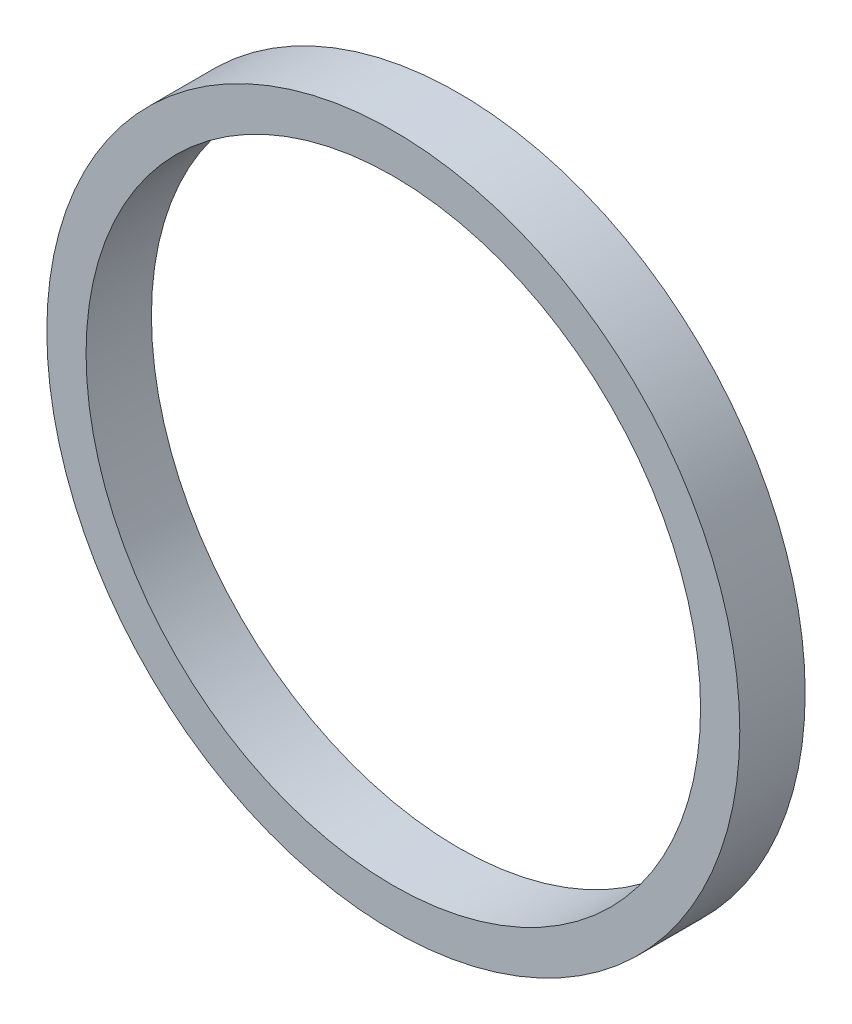
ISO-10303-21;
HEADER;
FILE_DESCRIPTION(('STEP AP214'),'2;1');
FILE_NAME('part.step','',(''),(''),'','','');
FILE_SCHEMA(('AUTOMOTIVE_DESIGN { 1 0 10303 214 1 1 1 1 }'));
ENDSEC;
DATA;
#1=APPLICATION_CONTEXT('core data for automotive mechanical design processes');
#2=APPLICATION_PROTOCOL_DEFINITION('international standard','automotive_design',2000,#1);
#3=PRODUCT_CONTEXT('',#1,'mechanical');
#4=PRODUCT('Part','Part','',(#3));
#5=PRODUCT_RELATED_PRODUCT_CATEGORY('part','',(#4));
#6=PRODUCT_DEFINITION_FORMATION('','',#4);
#7=PRODUCT_DEFINITION_CONTEXT('part definition',#1,'design');
#8=PRODUCT_DEFINITION('design','',#6,#7);
#9=PRODUCT_DEFINITION_SHAPE('','',#8);
#10=(LENGTH_UNIT() NAMED_UNIT(*) SI_UNIT(.MILLI.,.METRE.));
#11=(NAMED_UNIT(*) PLANE_ANGLE_UNIT() SI_UNIT($,.RADIAN.));
#12=(NAMED_UNIT(*) SI_UNIT($,.STERADIAN.) SOLID_ANGLE_UNIT());
#13=UNCERTAINTY_MEASURE_WITH_UNIT(LENGTH_MEASURE(1.E-05),#10,'distance_accuracy_value','');
#14=(GEOMETRIC_REPRESENTATION_CONTEXT(3) GLOBAL_UNCERTAINTY_ASSIGNED_CONTEXT((#13)) GLOBAL_UNIT_ASSIGNED_CONTEXT((#10,
#11,#12)) REPRESENTATION_CONTEXT('',''));
#15=CARTESIAN_POINT('',(0.,0.,0.));
#16=DIRECTION('',(0.,0.,1.));
#17=DIRECTION('',(1.,0.,0.));
#18=AXIS2_PLACEMENT_3D('',#15,#16,#17);
#19=CARTESIAN_POINT('',(0.,0.,3.));
#20=DIRECTION('',(0.,0.,1.));
#21=DIRECTION('',(1.,0.,0.));
#22=AXIS2_PLACEMENT_3D('',#19,#20,#21);
#23=PLANE('',#22);
#24=CARTESIAN_POINT('',(0.,0.,3.));
#25=DIRECTION('',(0.,0.,1.));
#26=DIRECTION('',(1.,0.,0.));
#27=AXIS2_PLACEMENT_3D('',#24,#25,#26);
#28=CIRCLE('',#27,15.9);
#29=CARTESIAN_POINT('',(15.9,0.,3.));
#30=VERTEX_POINT('',#29);
#31=EDGE_CURVE('E11',#30,#30,#28,.T.);
#32=ORIENTED_EDGE('',*,*,#31,.T.);
#33=EDGE_LOOP('',(#32));
#34=FACE_BOUND('',#33,.T.);
#35=CARTESIAN_POINT('',(0.,0.,3.));
#36=DIRECTION('',(0.,0.,1.));
#37=DIRECTION('',(1.,0.,0.));
#38=AXIS2_PLACEMENT_3D('',#35,#36,#37);
#39=CIRCLE('',#38,14.1);
#40=CARTESIAN_POINT('',(14.1,0.,3.));
#41=VERTEX_POINT('',#40);
#42=EDGE_CURVE('E58',#41,#41,#39,.T.);
#43=ORIENTED_EDGE('',*,*,#42,.F.);
#44=EDGE_LOOP('',(#43));
#45=FACE_BOUND('',#44,.T.);
#46=ADVANCED_FACE('F44',(#34,#45),#23,.T.);
#47=CARTESIAN_POINT('',(0.,0.,0.));
#48=DIRECTION('',(0.,0.,1.));
#49=DIRECTION('',(1.,0.,0.));
#50=AXIS2_PLACEMENT_3D('',#47,#48,#49);
#51=PLANE('',#50);
#52=CARTESIAN_POINT('',(0.,0.,0.));
#53=DIRECTION('',(0.,0.,1.));
#54=DIRECTION('',(1.,0.,0.));
#55=AXIS2_PLACEMENT_3D('',#52,#53,#54);
#56=CIRCLE('',#55,15.9);
#57=CARTESIAN_POINT('',(15.9,0.,0.));
#58=VERTEX_POINT('',#57);
#59=EDGE_CURVE('E48',#58,#58,#56,.T.);
#60=ORIENTED_EDGE('',*,*,#59,.F.);
#61=EDGE_LOOP('',(#60));
#62=FACE_BOUND('',#61,.T.);
#63=CARTESIAN_POINT('',(0.,0.,0.));
#64=DIRECTION('',(0.,0.,1.));
#65=DIRECTION('',(1.,0.,0.));
#66=AXIS2_PLACEMENT_3D('',#63,#64,#65);
#67=CIRCLE('',#66,14.1);
#68=CARTESIAN_POINT('',(14.1,0.,0.));
#69=VERTEX_POINT('',#68);
#70=EDGE_CURVE('E60',#69,#69,#67,.T.);
#71=ORIENTED_EDGE('',*,*,#70,.T.);
#72=EDGE_LOOP('',(#71));
#73=FACE_BOUND('',#72,.T.);
#74=ADVANCED_FACE('F71',(#62,#73),#51,.F.);
#75=CARTESIAN_POINT('',(0.,0.,3.));
#76=DIRECTION('',(0.,0.,-1.));
#77=DIRECTION('',(-1.,0.,0.));
#78=AXIS2_PLACEMENT_3D('',#75,#76,#77);
#79=CYLINDRICAL_SURFACE('',#78,15.9);
#80=ORIENTED_EDGE('',*,*,#31,.F.);
#81=EDGE_LOOP('',(#80));
#82=FACE_BOUND('',#81,.T.);
#83=ORIENTED_EDGE('',*,*,#59,.T.);
#84=EDGE_LOOP('',(#83));
#85=FACE_BOUND('',#84,.T.);
#86=ADVANCED_FACE('F46',(#82,#85),#79,.T.);
#87=CARTESIAN_POINT('',(0.,0.,3.));
#88=DIRECTION('',(0.,0.,-1.));
#89=DIRECTION('',(-1.,0.,0.));
#90=AXIS2_PLACEMENT_3D('',#87,#88,#89);
#91=CYLINDRICAL_SURFACE('',#90,14.1);
#92=ORIENTED_EDGE('',*,*,#42,.T.);
#93=EDGE_LOOP('',(#92));
#94=FACE_BOUND('',#93,.T.);
#95=ORIENTED_EDGE('',*,*,#70,.F.);
#96=EDGE_LOOP('',(#95));
#97=FACE_BOUND('',#96,.T.);
#98=ADVANCED_FACE('F67',(#94,#97),#91,.F.);
#99=CLOSED_SHELL('',(#46,#74,#86,#98));
#100=MANIFOLD_SOLID_BREP('B2',#99);
#101=ADVANCED_BREP_SHAPE_REPRESENTATION('',(#18,#100),#14);
#102=SHAPE_DEFINITION_REPRESENTATION(#9,#101);
ENDSEC;
END-ISO-10303-21;
